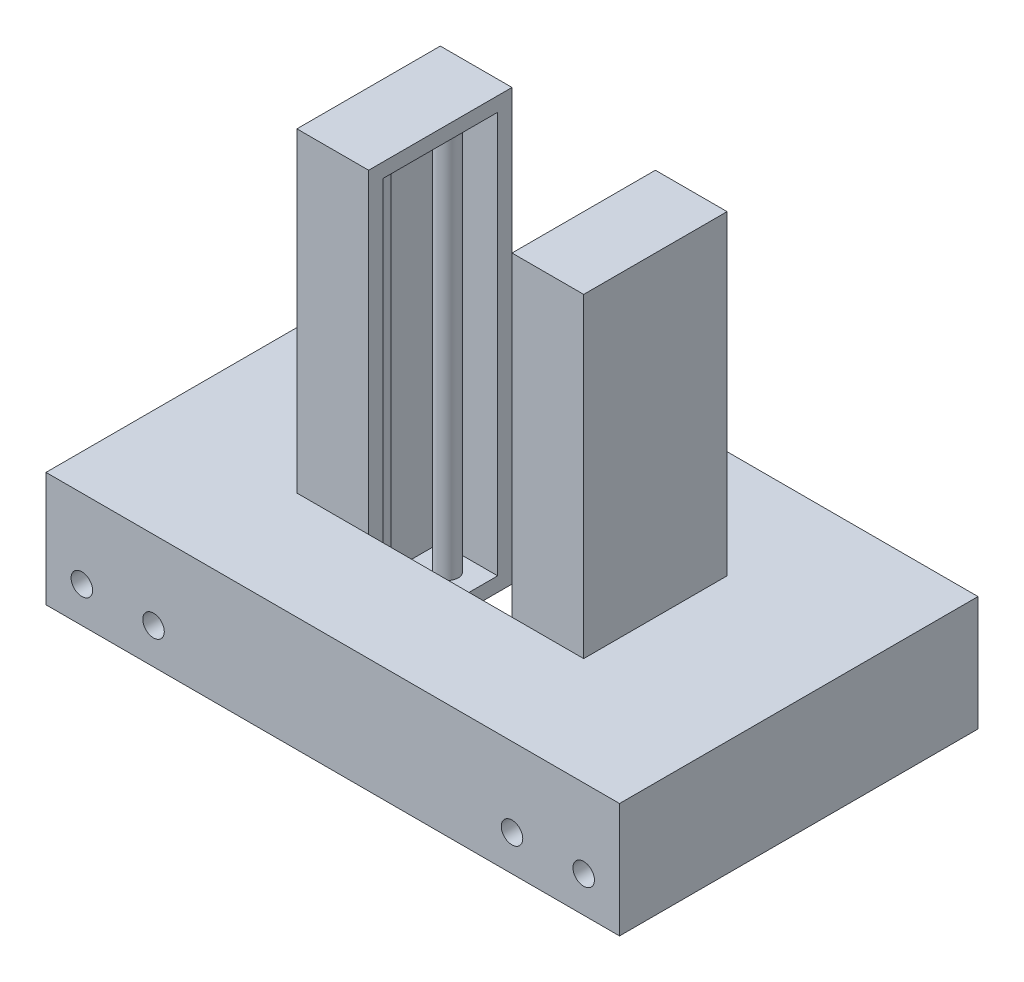
ISO-10303-21;
HEADER;
FILE_DESCRIPTION(('STEP AP214'),'2;1');
FILE_NAME('part.step','',(''),(''),'','','');
FILE_SCHEMA(('AUTOMOTIVE_DESIGN { 1 0 10303 214 1 1 1 1 }'));
ENDSEC;
DATA;
#1=APPLICATION_CONTEXT('core data for automotive mechanical design processes');
#2=APPLICATION_PROTOCOL_DEFINITION('international standard','automotive_design',2000,#1);
#3=PRODUCT_CONTEXT('',#1,'mechanical');
#4=PRODUCT('Part','Part','',(#3));
#5=PRODUCT_RELATED_PRODUCT_CATEGORY('part','',(#4));
#6=PRODUCT_DEFINITION_FORMATION('','',#4);
#7=PRODUCT_DEFINITION_CONTEXT('part definition',#1,'design');
#8=PRODUCT_DEFINITION('design','',#6,#7);
#9=PRODUCT_DEFINITION_SHAPE('','',#8);
#10=(LENGTH_UNIT() NAMED_UNIT(*) SI_UNIT(.MILLI.,.METRE.));
#11=(NAMED_UNIT(*) PLANE_ANGLE_UNIT() SI_UNIT($,.RADIAN.));
#12=(NAMED_UNIT(*) SI_UNIT($,.STERADIAN.) SOLID_ANGLE_UNIT());
#13=UNCERTAINTY_MEASURE_WITH_UNIT(LENGTH_MEASURE(1.E-05),#10,'distance_accuracy_value','');
#14=(GEOMETRIC_REPRESENTATION_CONTEXT(3) GLOBAL_UNCERTAINTY_ASSIGNED_CONTEXT((#13)) GLOBAL_UNIT_ASSIGNED_CONTEXT((#10,
#11,#12)) REPRESENTATION_CONTEXT('',''));
#15=CARTESIAN_POINT('',(0.,0.,0.));
#16=DIRECTION('',(0.,0.,1.));
#17=DIRECTION('',(1.,0.,0.));
#18=AXIS2_PLACEMENT_3D('',#15,#16,#17);
#19=CARTESIAN_POINT('',(-150.,0.,-1.38777878078145E-13));
#20=DIRECTION('',(1.,0.,0.));
#21=DIRECTION('',(0.,0.,1.));
#22=AXIS2_PLACEMENT_3D('',#19,#20,#21);
#23=PLANE('',#22);
#24=DIRECTION('',(0.,-1.,0.));
#25=VECTOR('',#24,1.);
#26=CARTESIAN_POINT('',(-150.,0.,-75.));
#27=LINE('',#26,#25);
#28=CARTESIAN_POINT('',(-150.,300.,-75.));
#29=VERTEX_POINT('',#28);
#30=CARTESIAN_POINT('',(-150.,80.,-75.));
#31=VERTEX_POINT('',#30);
#32=EDGE_CURVE('E238',#29,#31,#27,.T.);
#33=ORIENTED_EDGE('',*,*,#32,.F.);
#34=DIRECTION('',(0.,0.,1.));
#35=VECTOR('',#34,1.);
#36=CARTESIAN_POINT('',(-150.,300.,-75.));
#37=LINE('',#36,#35);
#38=CARTESIAN_POINT('',(-150.,300.,-175.));
#39=VERTEX_POINT('',#38);
#40=EDGE_CURVE('E241',#39,#29,#37,.T.);
#41=ORIENTED_EDGE('',*,*,#40,.F.);
#42=DIRECTION('',(0.,1.,0.));
#43=VECTOR('',#42,1.);
#44=CARTESIAN_POINT('',(-150.,0.,-175.));
#45=LINE('',#44,#43);
#46=CARTESIAN_POINT('',(-150.,80.,-175.));
#47=VERTEX_POINT('',#46);
#48=EDGE_CURVE('E245',#47,#39,#45,.T.);
#49=ORIENTED_EDGE('',*,*,#48,.F.);
#50=CARTESIAN_POINT('',(-150.,0.,-175.));
#51=VERTEX_POINT('',#50);
#52=EDGE_CURVE('E246',#51,#47,#45,.T.);
#53=ORIENTED_EDGE('',*,*,#52,.F.);
#54=DIRECTION('',(0.,0.,-1.));
#55=VECTOR('',#54,1.);
#56=CARTESIAN_POINT('',(-150.,0.,-75.));
#57=LINE('',#56,#55);
#58=CARTESIAN_POINT('',(-150.,0.,-75.));
#59=VERTEX_POINT('',#58);
#60=EDGE_CURVE('E249',#59,#51,#57,.T.);
#61=ORIENTED_EDGE('',*,*,#60,.F.);
#62=EDGE_CURVE('E242',#31,#59,#27,.T.);
#63=ORIENTED_EDGE('',*,*,#62,.F.);
#64=EDGE_LOOP('',(#33,#41,#49,#53,#61,#63));
#65=FACE_BOUND('',#64,.T.);
#66=DIRECTION('',(0.,-1.,0.));
#67=VECTOR('',#66,1.);
#68=CARTESIAN_POINT('',(-150.,290.,-85.));
#69=LINE('',#68,#67);
#70=CARTESIAN_POINT('',(-150.,290.,-85.));
#71=VERTEX_POINT('',#70);
#72=CARTESIAN_POINT('',(-150.,10.,-85.));
#73=VERTEX_POINT('',#72);
#74=EDGE_CURVE('E65',#71,#73,#69,.T.);
#75=ORIENTED_EDGE('',*,*,#74,.T.);
#76=DIRECTION('',(0.,0.,-1.));
#77=VECTOR('',#76,1.);
#78=CARTESIAN_POINT('',(-150.,10.,-85.));
#79=LINE('',#78,#77);
#80=CARTESIAN_POINT('',(-150.,10.,-165.));
#81=VERTEX_POINT('',#80);
#82=EDGE_CURVE('E219',#73,#81,#79,.T.);
#83=ORIENTED_EDGE('',*,*,#82,.T.);
#84=DIRECTION('',(0.,1.,0.));
#85=VECTOR('',#84,1.);
#86=CARTESIAN_POINT('',(-150.,290.,-165.));
#87=LINE('',#86,#85);
#88=CARTESIAN_POINT('',(-150.,290.,-165.));
#89=VERTEX_POINT('',#88);
#90=EDGE_CURVE('E222',#81,#89,#87,.T.);
#91=ORIENTED_EDGE('',*,*,#90,.T.);
#92=DIRECTION('',(0.,0.,1.));
#93=VECTOR('',#92,1.);
#94=CARTESIAN_POINT('',(-150.,290.,-85.));
#95=LINE('',#94,#93);
#96=EDGE_CURVE('E228',#89,#71,#95,.T.);
#97=ORIENTED_EDGE('',*,*,#96,.T.);
#98=EDGE_LOOP('',(#75,#83,#91,#97));
#99=FACE_BOUND('',#98,.T.);
#100=ADVANCED_FACE('F50',(#65,#99),#23,.F.);
#101=CARTESIAN_POINT('',(-300.,0.,-175.));
#102=DIRECTION('',(0.,0.,-1.));
#103=DIRECTION('',(-1.,0.,0.));
#104=AXIS2_PLACEMENT_3D('',#101,#102,#103);
#105=PLANE('',#104);
#106=ORIENTED_EDGE('',*,*,#52,.T.);
#107=DIRECTION('',(-1.,0.,0.));
#108=VECTOR('',#107,1.);
#109=CARTESIAN_POINT('',(-300.,80.,-175.));
#110=LINE('',#109,#108);
#111=CARTESIAN_POINT('',(-250.,80.,-175.));
#112=VERTEX_POINT('',#111);
#113=EDGE_CURVE('E339',#47,#112,#110,.T.);
#114=ORIENTED_EDGE('',*,*,#113,.T.);
#115=DIRECTION('',(0.,1.,0.));
#116=VECTOR('',#115,1.);
#117=CARTESIAN_POINT('',(-250.,0.,-175.));
#118=LINE('',#117,#116);
#119=CARTESIAN_POINT('',(-250.,0.,-175.));
#120=VERTEX_POINT('',#119);
#121=EDGE_CURVE('E305',#120,#112,#118,.T.);
#122=ORIENTED_EDGE('',*,*,#121,.F.);
#123=DIRECTION('',(-1.,0.,0.));
#124=VECTOR('',#123,1.);
#125=CARTESIAN_POINT('',(-300.,0.,-175.));
#126=LINE('',#125,#124);
#127=EDGE_CURVE('E325',#51,#120,#126,.T.);
#128=ORIENTED_EDGE('',*,*,#127,.F.);
#129=EDGE_LOOP('',(#106,#114,#122,#128));
#130=FACE_BOUND('',#129,.T.);
#131=ADVANCED_FACE('F438',(#130),#105,.F.);
#132=CARTESIAN_POINT('',(-300.,0.,-75.));
#133=DIRECTION('',(0.,0.,1.));
#134=DIRECTION('',(1.,0.,0.));
#135=AXIS2_PLACEMENT_3D('',#132,#133,#134);
#136=PLANE('',#135);
#137=ORIENTED_EDGE('',*,*,#62,.T.);
#138=DIRECTION('',(1.,0.,0.));
#139=VECTOR('',#138,1.);
#140=CARTESIAN_POINT('',(-300.,0.,-75.));
#141=LINE('',#140,#139);
#142=CARTESIAN_POINT('',(-250.,0.,-75.));
#143=VERTEX_POINT('',#142);
#144=EDGE_CURVE('E322',#143,#59,#141,.T.);
#145=ORIENTED_EDGE('',*,*,#144,.F.);
#146=DIRECTION('',(0.,-1.,0.));
#147=VECTOR('',#146,1.);
#148=CARTESIAN_POINT('',(-250.,0.,-75.));
#149=LINE('',#148,#147);
#150=CARTESIAN_POINT('',(-250.,80.,-75.));
#151=VERTEX_POINT('',#150);
#152=EDGE_CURVE('E393',#151,#143,#149,.T.);
#153=ORIENTED_EDGE('',*,*,#152,.F.);
#154=DIRECTION('',(1.,0.,0.));
#155=VECTOR('',#154,1.);
#156=CARTESIAN_POINT('',(-300.,80.,-75.));
#157=LINE('',#156,#155);
#158=EDGE_CURVE('E331',#151,#31,#157,.T.);
#159=ORIENTED_EDGE('',*,*,#158,.T.);
#160=EDGE_LOOP('',(#137,#145,#153,#159));
#161=FACE_BOUND('',#160,.T.);
#162=ADVANCED_FACE('F445',(#161),#136,.F.);
#163=CARTESIAN_POINT('',(0.,80.,0.));
#164=DIRECTION('',(-1.,0.,0.));
#165=DIRECTION('',(0.,0.,1.));
#166=AXIS2_PLACEMENT_3D('',#163,#164,#165);
#167=PLANE('',#166);
#168=DIRECTION('',(0.,0.,-1.));
#169=VECTOR('',#168,1.);
#170=CARTESIAN_POINT('',(0.,0.,0.));
#171=LINE('',#170,#169);
#172=CARTESIAN_POINT('',(0.,0.,0.));
#173=VERTEX_POINT('',#172);
#174=CARTESIAN_POINT('',(0.,0.,-250.));
#175=VERTEX_POINT('',#174);
#176=EDGE_CURVE('E343',#173,#175,#171,.T.);
#177=ORIENTED_EDGE('',*,*,#176,.T.);
#178=DIRECTION('',(0.,-1.,0.));
#179=VECTOR('',#178,1.);
#180=CARTESIAN_POINT('',(0.,80.,-250.));
#181=LINE('',#180,#179);
#182=CARTESIAN_POINT('',(0.,80.,-250.));
#183=VERTEX_POINT('',#182);
#184=EDGE_CURVE('E390',#183,#175,#181,.T.);
#185=ORIENTED_EDGE('',*,*,#184,.F.);
#186=DIRECTION('',(0.,0.,-1.));
#187=VECTOR('',#186,1.);
#188=CARTESIAN_POINT('',(0.,80.,0.));
#189=LINE('',#188,#187);
#190=CARTESIAN_POINT('',(0.,80.,0.));
#191=VERTEX_POINT('',#190);
#192=EDGE_CURVE('E364',#191,#183,#189,.T.);
#193=ORIENTED_EDGE('',*,*,#192,.F.);
#194=DIRECTION('',(0.,-1.,0.));
#195=VECTOR('',#194,1.);
#196=CARTESIAN_POINT('',(0.,80.,0.));
#197=LINE('',#196,#195);
#198=EDGE_CURVE('E374',#191,#173,#197,.T.);
#199=ORIENTED_EDGE('',*,*,#198,.T.);
#200=EDGE_LOOP('',(#177,#185,#193,#199));
#201=FACE_BOUND('',#200,.T.);
#202=ADVANCED_FACE('F52',(#201),#167,.F.);
#203=CARTESIAN_POINT('',(0.,80.,-250.));
#204=DIRECTION('',(0.,0.,1.));
#205=DIRECTION('',(1.,0.,0.));
#206=AXIS2_PLACEMENT_3D('',#203,#204,#205);
#207=PLANE('',#206);
#208=CARTESIAN_POINT('',(-375.,25.,-250.));
#209=DIRECTION('',(0.,0.,1.));
#210=DIRECTION('',(1.,0.,0.));
#211=AXIS2_PLACEMENT_3D('',#208,#209,#210);
#212=CIRCLE('',#211,7.50000000000001);
#213=CARTESIAN_POINT('',(-367.5,25.,-250.));
#214=VERTEX_POINT('',#213);
#215=EDGE_CURVE('E340',#214,#214,#212,.T.);
#216=ORIENTED_EDGE('',*,*,#215,.T.);
#217=EDGE_LOOP('',(#216));
#218=FACE_BOUND('',#217,.T.);
#219=CARTESIAN_POINT('',(-325.,25.,-250.));
#220=DIRECTION('',(0.,0.,1.));
#221=DIRECTION('',(1.,0.,0.));
#222=AXIS2_PLACEMENT_3D('',#219,#220,#221);
#223=CIRCLE('',#222,7.50000000000001);
#224=CARTESIAN_POINT('',(-317.5,25.,-250.));
#225=VERTEX_POINT('',#224);
#226=EDGE_CURVE('E350',#225,#225,#223,.T.);
#227=ORIENTED_EDGE('',*,*,#226,.T.);
#228=EDGE_LOOP('',(#227));
#229=FACE_BOUND('',#228,.T.);
#230=CARTESIAN_POINT('',(-75.,25.,-250.));
#231=DIRECTION('',(0.,0.,1.));
#232=DIRECTION('',(1.,0.,0.));
#233=AXIS2_PLACEMENT_3D('',#230,#231,#232);
#234=CIRCLE('',#233,7.50000000000001);
#235=CARTESIAN_POINT('',(-67.5,25.,-250.));
#236=VERTEX_POINT('',#235);
#237=EDGE_CURVE('E356',#236,#236,#234,.T.);
#238=ORIENTED_EDGE('',*,*,#237,.T.);
#239=EDGE_LOOP('',(#238));
#240=FACE_BOUND('',#239,.T.);
#241=CARTESIAN_POINT('',(-25.,25.,-250.));
#242=DIRECTION('',(0.,0.,1.));
#243=DIRECTION('',(1.,0.,0.));
#244=AXIS2_PLACEMENT_3D('',#241,#242,#243);
#245=CIRCLE('',#244,7.5);
#246=CARTESIAN_POINT('',(-17.5,25.,-250.));
#247=VERTEX_POINT('',#246);
#248=EDGE_CURVE('E328',#247,#247,#245,.T.);
#249=ORIENTED_EDGE('',*,*,#248,.T.);
#250=EDGE_LOOP('',(#249));
#251=FACE_BOUND('',#250,.T.);
#252=DIRECTION('',(-1.,0.,0.));
#253=VECTOR('',#252,1.);
#254=CARTESIAN_POINT('',(0.,0.,-250.));
#255=LINE('',#254,#253);
#256=CARTESIAN_POINT('',(-400.,0.,-250.));
#257=VERTEX_POINT('',#256);
#258=EDGE_CURVE('E377',#175,#257,#255,.T.);
#259=ORIENTED_EDGE('',*,*,#258,.T.);
#260=DIRECTION('',(0.,-1.,0.));
#261=VECTOR('',#260,1.);
#262=CARTESIAN_POINT('',(-400.,80.,-250.));
#263=LINE('',#262,#261);
#264=CARTESIAN_POINT('',(-400.,80.,-250.));
#265=VERTEX_POINT('',#264);
#266=EDGE_CURVE('E387',#265,#257,#263,.T.);
#267=ORIENTED_EDGE('',*,*,#266,.F.);
#268=DIRECTION('',(-1.,0.,0.));
#269=VECTOR('',#268,1.);
#270=CARTESIAN_POINT('',(0.,80.,-250.));
#271=LINE('',#270,#269);
#272=EDGE_CURVE('E367',#183,#265,#271,.T.);
#273=ORIENTED_EDGE('',*,*,#272,.F.);
#274=ORIENTED_EDGE('',*,*,#184,.T.);
#275=EDGE_LOOP('',(#259,#267,#273,#274));
#276=FACE_BOUND('',#275,.T.);
#277=ADVANCED_FACE('F538',(#218,#229,#240,#251,#276),#207,.F.);
#278=CARTESIAN_POINT('',(-400.,80.,0.));
#279=DIRECTION('',(1.,0.,0.));
#280=DIRECTION('',(0.,0.,-1.));
#281=AXIS2_PLACEMENT_3D('',#278,#279,#280);
#282=PLANE('',#281);
#283=DIRECTION('',(0.,0.,1.));
#284=VECTOR('',#283,1.);
#285=CARTESIAN_POINT('',(-400.,0.,0.));
#286=LINE('',#285,#284);
#287=CARTESIAN_POINT('',(-400.,0.,0.));
#288=VERTEX_POINT('',#287);
#289=EDGE_CURVE('E379',#257,#288,#286,.T.);
#290=ORIENTED_EDGE('',*,*,#289,.T.);
#291=DIRECTION('',(0.,-1.,0.));
#292=VECTOR('',#291,1.);
#293=CARTESIAN_POINT('',(-400.,80.,0.));
#294=LINE('',#293,#292);
#295=CARTESIAN_POINT('',(-400.,80.,0.));
#296=VERTEX_POINT('',#295);
#297=EDGE_CURVE('E384',#296,#288,#294,.T.);
#298=ORIENTED_EDGE('',*,*,#297,.F.);
#299=DIRECTION('',(0.,0.,1.));
#300=VECTOR('',#299,1.);
#301=CARTESIAN_POINT('',(-400.,80.,0.));
#302=LINE('',#301,#300);
#303=EDGE_CURVE('E370',#265,#296,#302,.T.);
#304=ORIENTED_EDGE('',*,*,#303,.F.);
#305=ORIENTED_EDGE('',*,*,#266,.T.);
#306=EDGE_LOOP('',(#290,#298,#304,#305));
#307=FACE_BOUND('',#306,.T.);
#308=ADVANCED_FACE('F535',(#307),#282,.F.);
#309=CARTESIAN_POINT('',(0.,80.,0.));
#310=DIRECTION('',(0.,0.,-1.));
#311=DIRECTION('',(-1.,0.,0.));
#312=AXIS2_PLACEMENT_3D('',#309,#310,#311);
#313=PLANE('',#312);
#314=CARTESIAN_POINT('',(-375.,25.,0.));
#315=DIRECTION('',(0.,0.,1.));
#316=DIRECTION('',(1.,0.,0.));
#317=AXIS2_PLACEMENT_3D('',#314,#315,#316);
#318=CIRCLE('',#317,7.50000000000001);
#319=CARTESIAN_POINT('',(-367.5,25.,0.));
#320=VERTEX_POINT('',#319);
#321=EDGE_CURVE('E344',#320,#320,#318,.T.);
#322=ORIENTED_EDGE('',*,*,#321,.F.);
#323=EDGE_LOOP('',(#322));
#324=FACE_BOUND('',#323,.T.);
#325=CARTESIAN_POINT('',(-325.,25.,0.));
#326=DIRECTION('',(0.,0.,1.));
#327=DIRECTION('',(1.,0.,0.));
#328=AXIS2_PLACEMENT_3D('',#325,#326,#327);
#329=CIRCLE('',#328,7.50000000000001);
#330=CARTESIAN_POINT('',(-317.5,25.,0.));
#331=VERTEX_POINT('',#330);
#332=EDGE_CURVE('E347',#331,#331,#329,.T.);
#333=ORIENTED_EDGE('',*,*,#332,.F.);
#334=EDGE_LOOP('',(#333));
#335=FACE_BOUND('',#334,.T.);
#336=CARTESIAN_POINT('',(-75.,25.,0.));
#337=DIRECTION('',(0.,0.,1.));
#338=DIRECTION('',(1.,0.,0.));
#339=AXIS2_PLACEMENT_3D('',#336,#337,#338);
#340=CIRCLE('',#339,7.50000000000001);
#341=CARTESIAN_POINT('',(-67.5,25.,0.));
#342=VERTEX_POINT('',#341);
#343=EDGE_CURVE('E353',#342,#342,#340,.T.);
#344=ORIENTED_EDGE('',*,*,#343,.F.);
#345=EDGE_LOOP('',(#344));
#346=FACE_BOUND('',#345,.T.);
#347=CARTESIAN_POINT('',(-25.,25.,0.));
#348=DIRECTION('',(0.,0.,1.));
#349=DIRECTION('',(1.,0.,0.));
#350=AXIS2_PLACEMENT_3D('',#347,#348,#349);
#351=CIRCLE('',#350,7.5);
#352=CARTESIAN_POINT('',(-17.5,25.,0.));
#353=VERTEX_POINT('',#352);
#354=EDGE_CURVE('E359',#353,#353,#351,.T.);
#355=ORIENTED_EDGE('',*,*,#354,.F.);
#356=EDGE_LOOP('',(#355));
#357=FACE_BOUND('',#356,.T.);
#358=DIRECTION('',(1.,0.,0.));
#359=VECTOR('',#358,1.);
#360=CARTESIAN_POINT('',(0.,0.,0.));
#361=LINE('',#360,#359);
#362=EDGE_CURVE('E368',#288,#173,#361,.T.);
#363=ORIENTED_EDGE('',*,*,#362,.T.);
#364=ORIENTED_EDGE('',*,*,#198,.F.);
#365=DIRECTION('',(1.,0.,0.));
#366=VECTOR('',#365,1.);
#367=CARTESIAN_POINT('',(0.,80.,0.));
#368=LINE('',#367,#366);
#369=EDGE_CURVE('E372',#296,#191,#368,.T.);
#370=ORIENTED_EDGE('',*,*,#369,.F.);
#371=ORIENTED_EDGE('',*,*,#297,.T.);
#372=EDGE_LOOP('',(#363,#364,#370,#371));
#373=FACE_BOUND('',#372,.T.);
#374=ADVANCED_FACE('F528',(#324,#335,#346,#357,#373),#313,.F.);
#375=CARTESIAN_POINT('',(0.,80.,0.));
#376=DIRECTION('',(0.,1.,0.));
#377=DIRECTION('',(0.,0.,1.));
#378=AXIS2_PLACEMENT_3D('',#375,#376,#377);
#379=PLANE('',#378);
#380=DIRECTION('',(0.,0.,1.));
#381=VECTOR('',#380,1.);
#382=CARTESIAN_POINT('',(-300.,80.,-175.));
#383=LINE('',#382,#381);
#384=CARTESIAN_POINT('',(-300.,80.,-175.));
#385=VERTEX_POINT('',#384);
#386=CARTESIAN_POINT('',(-300.,80.,-75.));
#387=VERTEX_POINT('',#386);
#388=EDGE_CURVE('E321',#385,#387,#383,.T.);
#389=ORIENTED_EDGE('',*,*,#388,.F.);
#390=EDGE_CURVE('E337',#112,#385,#110,.T.);
#391=ORIENTED_EDGE('',*,*,#390,.F.);
#392=ORIENTED_EDGE('',*,*,#113,.F.);
#393=CARTESIAN_POINT('',(-100.,80.,-175.));
#394=VERTEX_POINT('',#393);
#395=EDGE_CURVE('E326',#394,#47,#110,.T.);
#396=ORIENTED_EDGE('',*,*,#395,.F.);
#397=DIRECTION('',(0.,0.,-1.));
#398=VECTOR('',#397,1.);
#399=CARTESIAN_POINT('',(-100.,80.,-175.));
#400=LINE('',#399,#398);
#401=CARTESIAN_POINT('',(-99.9999999999999,80.,-75.));
#402=VERTEX_POINT('',#401);
#403=EDGE_CURVE('E335',#402,#394,#400,.T.);
#404=ORIENTED_EDGE('',*,*,#403,.F.);
#405=DIRECTION('',(1.,0.,0.));
#406=VECTOR('',#405,1.);
#407=CARTESIAN_POINT('',(0.,80.,-75.));
#408=LINE('',#407,#406);
#409=EDGE_CURVE('E264',#31,#402,#408,.T.);
#410=ORIENTED_EDGE('',*,*,#409,.F.);
#411=ORIENTED_EDGE('',*,*,#158,.F.);
#412=EDGE_CURVE('E332',#387,#151,#157,.T.);
#413=ORIENTED_EDGE('',*,*,#412,.F.);
#414=EDGE_LOOP('',(#389,#391,#392,#396,#404,#410,#411,#413));
#415=FACE_BOUND('',#414,.T.);
#416=ORIENTED_EDGE('',*,*,#192,.T.);
#417=ORIENTED_EDGE('',*,*,#272,.T.);
#418=ORIENTED_EDGE('',*,*,#303,.T.);
#419=ORIENTED_EDGE('',*,*,#369,.T.);
#420=EDGE_LOOP('',(#416,#417,#418,#419));
#421=FACE_BOUND('',#420,.T.);
#422=ADVANCED_FACE('F525',(#415,#421),#379,.T.);
#423=CARTESIAN_POINT('',(0.,0.,0.));
#424=DIRECTION('',(0.,1.,0.));
#425=DIRECTION('',(0.,0.,1.));
#426=AXIS2_PLACEMENT_3D('',#423,#424,#425);
#427=PLANE('',#426);
#428=ORIENTED_EDGE('',*,*,#60,.T.);
#429=ORIENTED_EDGE('',*,*,#127,.T.);
#430=DIRECTION('',(0.,0.,-1.));
#431=VECTOR('',#430,1.);
#432=CARTESIAN_POINT('',(-250.,0.,-75.));
#433=LINE('',#432,#431);
#434=EDGE_CURVE('E300',#143,#120,#433,.T.);
#435=ORIENTED_EDGE('',*,*,#434,.F.);
#436=ORIENTED_EDGE('',*,*,#144,.T.);
#437=EDGE_LOOP('',(#428,#429,#435,#436));
#438=FACE_BOUND('',#437,.T.);
#439=ORIENTED_EDGE('',*,*,#176,.F.);
#440=ORIENTED_EDGE('',*,*,#362,.F.);
#441=ORIENTED_EDGE('',*,*,#289,.F.);
#442=ORIENTED_EDGE('',*,*,#258,.F.);
#443=EDGE_LOOP('',(#439,#440,#441,#442));
#444=FACE_BOUND('',#443,.T.);
#445=ADVANCED_FACE('F523',(#438,#444),#427,.F.);
#446=CARTESIAN_POINT('',(-25.,25.,-250.));
#447=DIRECTION('',(0.,0.,1.));
#448=DIRECTION('',(1.,0.,0.));
#449=AXIS2_PLACEMENT_3D('',#446,#447,#448);
#450=CYLINDRICAL_SURFACE('',#449,7.5);
#451=ORIENTED_EDGE('',*,*,#248,.F.);
#452=EDGE_LOOP('',(#451));
#453=FACE_BOUND('',#452,.T.);
#454=ORIENTED_EDGE('',*,*,#354,.T.);
#455=EDGE_LOOP('',(#454));
#456=FACE_BOUND('',#455,.T.);
#457=ADVANCED_FACE('F519',(#453,#456),#450,.F.);
#458=CARTESIAN_POINT('',(-75.,25.,-250.));
#459=DIRECTION('',(0.,0.,1.));
#460=DIRECTION('',(1.,0.,0.));
#461=AXIS2_PLACEMENT_3D('',#458,#459,#460);
#462=CYLINDRICAL_SURFACE('',#461,7.50000000000001);
#463=ORIENTED_EDGE('',*,*,#237,.F.);
#464=EDGE_LOOP('',(#463));
#465=FACE_BOUND('',#464,.T.);
#466=ORIENTED_EDGE('',*,*,#343,.T.);
#467=EDGE_LOOP('',(#466));
#468=FACE_BOUND('',#467,.T.);
#469=ADVANCED_FACE('F515',(#465,#468),#462,.F.);
#470=CARTESIAN_POINT('',(-325.,25.,-250.));
#471=DIRECTION('',(0.,0.,1.));
#472=DIRECTION('',(1.,0.,0.));
#473=AXIS2_PLACEMENT_3D('',#470,#471,#472);
#474=CYLINDRICAL_SURFACE('',#473,7.50000000000001);
#475=ORIENTED_EDGE('',*,*,#226,.F.);
#476=EDGE_LOOP('',(#475));
#477=FACE_BOUND('',#476,.T.);
#478=ORIENTED_EDGE('',*,*,#332,.T.);
#479=EDGE_LOOP('',(#478));
#480=FACE_BOUND('',#479,.T.);
#481=ADVANCED_FACE('F511',(#477,#480),#474,.F.);
#482=CARTESIAN_POINT('',(-375.,25.,-250.));
#483=DIRECTION('',(0.,0.,1.));
#484=DIRECTION('',(1.,0.,0.));
#485=AXIS2_PLACEMENT_3D('',#482,#483,#484);
#486=CYLINDRICAL_SURFACE('',#485,7.50000000000001);
#487=ORIENTED_EDGE('',*,*,#215,.F.);
#488=EDGE_LOOP('',(#487));
#489=FACE_BOUND('',#488,.T.);
#490=ORIENTED_EDGE('',*,*,#321,.T.);
#491=EDGE_LOOP('',(#490));
#492=FACE_BOUND('',#491,.T.);
#493=ADVANCED_FACE('F503',(#489,#492),#486,.F.);
#494=CARTESIAN_POINT('',(-250.,0.,-75.));
#495=DIRECTION('',(0.,0.,-1.));
#496=DIRECTION('',(-1.,0.,0.));
#497=AXIS2_PLACEMENT_3D('',#494,#495,#496);
#498=PLANE('',#497);
#499=ORIENTED_EDGE('',*,*,#412,.T.);
#500=DIRECTION('',(0.,-1.,0.));
#501=VECTOR('',#500,1.);
#502=CARTESIAN_POINT('',(-250.,0.,-75.));
#503=LINE('',#502,#501);
#504=CARTESIAN_POINT('',(-250.,300.,-75.));
#505=VERTEX_POINT('',#504);
#506=EDGE_CURVE('E297',#505,#151,#503,.T.);
#507=ORIENTED_EDGE('',*,*,#506,.F.);
#508=DIRECTION('',(-1.,0.,0.));
#509=VECTOR('',#508,1.);
#510=CARTESIAN_POINT('',(-250.,300.,-75.));
#511=LINE('',#510,#509);
#512=CARTESIAN_POINT('',(-300.,300.,-75.));
#513=VERTEX_POINT('',#512);
#514=EDGE_CURVE('E310',#505,#513,#511,.T.);
#515=ORIENTED_EDGE('',*,*,#514,.T.);
#516=DIRECTION('',(0.,-1.,0.));
#517=VECTOR('',#516,1.);
#518=CARTESIAN_POINT('',(-300.,0.,-75.));
#519=LINE('',#518,#517);
#520=EDGE_CURVE('E291',#513,#387,#519,.T.);
#521=ORIENTED_EDGE('',*,*,#520,.T.);
#522=EDGE_LOOP('',(#499,#507,#515,#521));
#523=FACE_BOUND('',#522,.T.);
#524=ADVANCED_FACE('F500',(#523),#498,.F.);
#525=CARTESIAN_POINT('',(-250.,0.,-175.));
#526=DIRECTION('',(0.,0.,1.));
#527=DIRECTION('',(1.,0.,0.));
#528=AXIS2_PLACEMENT_3D('',#525,#526,#527);
#529=PLANE('',#528);
#530=ORIENTED_EDGE('',*,*,#390,.T.);
#531=DIRECTION('',(0.,1.,0.));
#532=VECTOR('',#531,1.);
#533=CARTESIAN_POINT('',(-300.,0.,-175.));
#534=LINE('',#533,#532);
#535=CARTESIAN_POINT('',(-300.,300.,-175.));
#536=VERTEX_POINT('',#535);
#537=EDGE_CURVE('E313',#385,#536,#534,.T.);
#538=ORIENTED_EDGE('',*,*,#537,.T.);
#539=DIRECTION('',(-1.,0.,0.));
#540=VECTOR('',#539,1.);
#541=CARTESIAN_POINT('',(-250.,300.,-175.));
#542=LINE('',#541,#540);
#543=CARTESIAN_POINT('',(-250.,300.,-175.));
#544=VERTEX_POINT('',#543);
#545=EDGE_CURVE('E318',#544,#536,#542,.T.);
#546=ORIENTED_EDGE('',*,*,#545,.F.);
#547=EDGE_CURVE('E304',#112,#544,#118,.T.);
#548=ORIENTED_EDGE('',*,*,#547,.F.);
#549=EDGE_LOOP('',(#530,#538,#546,#548));
#550=FACE_BOUND('',#549,.T.);
#551=ADVANCED_FACE('F496',(#550),#529,.F.);
#552=CARTESIAN_POINT('',(-250.,300.,-75.));
#553=DIRECTION('',(0.,-1.,0.));
#554=DIRECTION('',(0.,0.,-1.));
#555=AXIS2_PLACEMENT_3D('',#552,#553,#554);
#556=PLANE('',#555);
#557=DIRECTION('',(0.,0.,1.));
#558=VECTOR('',#557,1.);
#559=CARTESIAN_POINT('',(-300.,300.,-75.));
#560=LINE('',#559,#558);
#561=EDGE_CURVE('E301',#536,#513,#560,.T.);
#562=ORIENTED_EDGE('',*,*,#561,.T.);
#563=ORIENTED_EDGE('',*,*,#514,.F.);
#564=DIRECTION('',(0.,0.,1.));
#565=VECTOR('',#564,1.);
#566=CARTESIAN_POINT('',(-250.,300.,-75.));
#567=LINE('',#566,#565);
#568=EDGE_CURVE('E308',#544,#505,#567,.T.);
#569=ORIENTED_EDGE('',*,*,#568,.F.);
#570=ORIENTED_EDGE('',*,*,#545,.T.);
#571=EDGE_LOOP('',(#562,#563,#569,#570));
#572=FACE_BOUND('',#571,.T.);
#573=ADVANCED_FACE('F489',(#572),#556,.F.);
#574=CARTESIAN_POINT('',(-250.,0.,-1.38777878078145E-13));
#575=DIRECTION('',(-1.,0.,0.));
#576=DIRECTION('',(0.,0.,1.));
#577=AXIS2_PLACEMENT_3D('',#574,#575,#576);
#578=PLANE('',#577);
#579=DIRECTION('',(0.,0.,-1.));
#580=VECTOR('',#579,1.);
#581=CARTESIAN_POINT('',(-250.,10.,-85.));
#582=LINE('',#581,#580);
#583=CARTESIAN_POINT('',(-250.,10.,-85.));
#584=VERTEX_POINT('',#583);
#585=CARTESIAN_POINT('',(-250.,10.,-165.));
#586=VERTEX_POINT('',#585);
#587=EDGE_CURVE('E281',#584,#586,#582,.T.);
#588=ORIENTED_EDGE('',*,*,#587,.F.);
#589=DIRECTION('',(0.,-1.,0.));
#590=VECTOR('',#589,1.);
#591=CARTESIAN_POINT('',(-250.,290.,-85.));
#592=LINE('',#591,#590);
#593=CARTESIAN_POINT('',(-250.,290.,-85.));
#594=VERTEX_POINT('',#593);
#595=EDGE_CURVE('E73',#594,#584,#592,.T.);
#596=ORIENTED_EDGE('',*,*,#595,.F.);
#597=DIRECTION('',(0.,0.,1.));
#598=VECTOR('',#597,1.);
#599=CARTESIAN_POINT('',(-250.,290.,-85.));
#600=LINE('',#599,#598);
#601=CARTESIAN_POINT('',(-250.,290.,-165.));
#602=VERTEX_POINT('',#601);
#603=EDGE_CURVE('E270',#602,#594,#600,.T.);
#604=ORIENTED_EDGE('',*,*,#603,.F.);
#605=DIRECTION('',(0.,1.,0.));
#606=VECTOR('',#605,1.);
#607=CARTESIAN_POINT('',(-250.,290.,-165.));
#608=LINE('',#607,#606);
#609=EDGE_CURVE('E284',#586,#602,#608,.T.);
#610=ORIENTED_EDGE('',*,*,#609,.F.);
#611=EDGE_LOOP('',(#588,#596,#604,#610));
#612=FACE_BOUND('',#611,.T.);
#613=ORIENTED_EDGE('',*,*,#506,.T.);
#614=ORIENTED_EDGE('',*,*,#152,.T.);
#615=ORIENTED_EDGE('',*,*,#434,.T.);
#616=ORIENTED_EDGE('',*,*,#121,.T.);
#617=ORIENTED_EDGE('',*,*,#547,.T.);
#618=ORIENTED_EDGE('',*,*,#568,.T.);
#619=EDGE_LOOP('',(#613,#614,#615,#616,#617,#618));
#620=FACE_BOUND('',#619,.T.);
#621=ADVANCED_FACE('F486',(#612,#620),#578,.F.);
#622=CARTESIAN_POINT('',(-300.,0.,-1.66533453693774E-13));
#623=DIRECTION('',(-1.,0.,0.));
#624=DIRECTION('',(0.,0.,1.));
#625=AXIS2_PLACEMENT_3D('',#622,#623,#624);
#626=PLANE('',#625);
#627=ORIENTED_EDGE('',*,*,#537,.F.);
#628=ORIENTED_EDGE('',*,*,#388,.T.);
#629=ORIENTED_EDGE('',*,*,#520,.F.);
#630=ORIENTED_EDGE('',*,*,#561,.F.);
#631=EDGE_LOOP('',(#627,#628,#629,#630));
#632=FACE_BOUND('',#631,.T.);
#633=ADVANCED_FACE('F485',(#632),#626,.T.);
#634=CARTESIAN_POINT('',(-290.,290.,-85.));
#635=DIRECTION('',(0.,0.,1.));
#636=DIRECTION('',(1.,0.,0.));
#637=AXIS2_PLACEMENT_3D('',#634,#635,#636);
#638=PLANE('',#637);
#639=ORIENTED_EDGE('',*,*,#595,.T.);
#640=DIRECTION('',(1.,0.,0.));
#641=VECTOR('',#640,1.);
#642=CARTESIAN_POINT('',(-290.,10.,-85.));
#643=LINE('',#642,#641);
#644=CARTESIAN_POINT('',(-290.,10.,-85.));
#645=VERTEX_POINT('',#644);
#646=EDGE_CURVE('E279',#645,#584,#643,.T.);
#647=ORIENTED_EDGE('',*,*,#646,.F.);
#648=DIRECTION('',(0.,-1.,0.));
#649=VECTOR('',#648,1.);
#650=CARTESIAN_POINT('',(-290.,290.,-85.));
#651=LINE('',#650,#649);
#652=CARTESIAN_POINT('',(-290.,290.,-85.));
#653=VERTEX_POINT('',#652);
#654=EDGE_CURVE('E266',#653,#645,#651,.T.);
#655=ORIENTED_EDGE('',*,*,#654,.F.);
#656=DIRECTION('',(1.,0.,0.));
#657=VECTOR('',#656,1.);
#658=CARTESIAN_POINT('',(-290.,290.,-85.));
#659=LINE('',#658,#657);
#660=EDGE_CURVE('E289',#653,#594,#659,.T.);
#661=ORIENTED_EDGE('',*,*,#660,.T.);
#662=EDGE_LOOP('',(#639,#647,#655,#661));
#663=FACE_BOUND('',#662,.T.);
#664=ADVANCED_FACE('F475',(#663),#638,.F.);
#665=CARTESIAN_POINT('',(-290.,290.,-85.));
#666=DIRECTION('',(0.,1.,0.));
#667=DIRECTION('',(0.,0.,1.));
#668=AXIS2_PLACEMENT_3D('',#665,#666,#667);
#669=PLANE('',#668);
#670=CARTESIAN_POINT('',(-270.,290.,-150.));
#671=DIRECTION('',(0.,1.,0.));
#672=DIRECTION('',(0.,0.,1.));
#673=AXIS2_PLACEMENT_3D('',#670,#671,#672);
#674=CIRCLE('',#673,7.50000000000001);
#675=CARTESIAN_POINT('',(-270.,290.,-142.5));
#676=VERTEX_POINT('',#675);
#677=EDGE_CURVE('E405',#676,#676,#674,.F.);
#678=ORIENTED_EDGE('',*,*,#677,.F.);
#679=EDGE_LOOP('',(#678));
#680=FACE_BOUND('',#679,.T.);
#681=CARTESIAN_POINT('',(-270.,290.,-99.9999999999999));
#682=DIRECTION('',(0.,1.,0.));
#683=DIRECTION('',(0.,0.,1.));
#684=AXIS2_PLACEMENT_3D('',#681,#682,#683);
#685=CIRCLE('',#684,7.50000000000001);
#686=CARTESIAN_POINT('',(-270.,290.,-92.4999999999999));
#687=VERTEX_POINT('',#686);
#688=EDGE_CURVE('E402',#687,#687,#685,.F.);
#689=ORIENTED_EDGE('',*,*,#688,.F.);
#690=EDGE_LOOP('',(#689));
#691=FACE_BOUND('',#690,.T.);
#692=ORIENTED_EDGE('',*,*,#603,.T.);
#693=ORIENTED_EDGE('',*,*,#660,.F.);
#694=DIRECTION('',(0.,0.,1.));
#695=VECTOR('',#694,1.);
#696=CARTESIAN_POINT('',(-290.,290.,-85.));
#697=LINE('',#696,#695);
#698=CARTESIAN_POINT('',(-290.,290.,-165.));
#699=VERTEX_POINT('',#698);
#700=EDGE_CURVE('E276',#699,#653,#697,.T.);
#701=ORIENTED_EDGE('',*,*,#700,.F.);
#702=DIRECTION('',(1.,0.,0.));
#703=VECTOR('',#702,1.);
#704=CARTESIAN_POINT('',(-290.,290.,-165.));
#705=LINE('',#704,#703);
#706=EDGE_CURVE('E292',#699,#602,#705,.T.);
#707=ORIENTED_EDGE('',*,*,#706,.T.);
#708=EDGE_LOOP('',(#692,#693,#701,#707));
#709=FACE_BOUND('',#708,.T.);
#710=ADVANCED_FACE('F471',(#680,#691,#709),#669,.F.);
#711=CARTESIAN_POINT('',(-290.,290.,-165.));
#712=DIRECTION('',(0.,0.,-1.));
#713=DIRECTION('',(-1.,0.,0.));
#714=AXIS2_PLACEMENT_3D('',#711,#712,#713);
#715=PLANE('',#714);
#716=ORIENTED_EDGE('',*,*,#609,.T.);
#717=ORIENTED_EDGE('',*,*,#706,.F.);
#718=DIRECTION('',(0.,1.,0.));
#719=VECTOR('',#718,1.);
#720=CARTESIAN_POINT('',(-290.,290.,-165.));
#721=LINE('',#720,#719);
#722=CARTESIAN_POINT('',(-290.,10.,-165.));
#723=VERTEX_POINT('',#722);
#724=EDGE_CURVE('E273',#723,#699,#721,.T.);
#725=ORIENTED_EDGE('',*,*,#724,.F.);
#726=DIRECTION('',(1.,0.,0.));
#727=VECTOR('',#726,1.);
#728=CARTESIAN_POINT('',(-290.,10.,-165.));
#729=LINE('',#728,#727);
#730=EDGE_CURVE('E294',#723,#586,#729,.T.);
#731=ORIENTED_EDGE('',*,*,#730,.T.);
#732=EDGE_LOOP('',(#716,#717,#725,#731));
#733=FACE_BOUND('',#732,.T.);
#734=ADVANCED_FACE('F474',(#733),#715,.F.);
#735=CARTESIAN_POINT('',(-290.,10.,-85.));
#736=DIRECTION('',(0.,-1.,0.));
#737=DIRECTION('',(0.,0.,-1.));
#738=AXIS2_PLACEMENT_3D('',#735,#736,#737);
#739=PLANE('',#738);
#740=CARTESIAN_POINT('',(-270.,10.,-150.));
#741=DIRECTION('',(0.,-1.,0.));
#742=DIRECTION('',(0.,0.,-1.));
#743=AXIS2_PLACEMENT_3D('',#740,#741,#742);
#744=CIRCLE('',#743,7.50000000000001);
#745=CARTESIAN_POINT('',(-270.,10.,-157.5));
#746=VERTEX_POINT('',#745);
#747=EDGE_CURVE('E399',#746,#746,#744,.F.);
#748=ORIENTED_EDGE('',*,*,#747,.F.);
#749=EDGE_LOOP('',(#748));
#750=FACE_BOUND('',#749,.T.);
#751=CARTESIAN_POINT('',(-270.,10.,-99.9999999999999));
#752=DIRECTION('',(0.,-1.,0.));
#753=DIRECTION('',(0.,0.,-1.));
#754=AXIS2_PLACEMENT_3D('',#751,#752,#753);
#755=CIRCLE('',#754,7.50000000000001);
#756=CARTESIAN_POINT('',(-270.,10.,-107.5));
#757=VERTEX_POINT('',#756);
#758=EDGE_CURVE('E396',#757,#757,#755,.F.);
#759=ORIENTED_EDGE('',*,*,#758,.F.);
#760=EDGE_LOOP('',(#759));
#761=FACE_BOUND('',#760,.T.);
#762=ORIENTED_EDGE('',*,*,#587,.T.);
#763=ORIENTED_EDGE('',*,*,#730,.F.);
#764=DIRECTION('',(0.,0.,-1.));
#765=VECTOR('',#764,1.);
#766=CARTESIAN_POINT('',(-290.,10.,-85.));
#767=LINE('',#766,#765);
#768=EDGE_CURVE('E269',#645,#723,#767,.T.);
#769=ORIENTED_EDGE('',*,*,#768,.F.);
#770=ORIENTED_EDGE('',*,*,#646,.T.);
#771=EDGE_LOOP('',(#762,#763,#769,#770));
#772=FACE_BOUND('',#771,.T.);
#773=ADVANCED_FACE('F469',(#750,#761,#772),#739,.F.);
#774=CARTESIAN_POINT('',(-290.,0.,-1.95676808090184E-13));
#775=DIRECTION('',(1.,0.,0.));
#776=DIRECTION('',(0.,0.,-1.));
#777=AXIS2_PLACEMENT_3D('',#774,#775,#776);
#778=PLANE('',#777);
#779=ORIENTED_EDGE('',*,*,#654,.T.);
#780=ORIENTED_EDGE('',*,*,#768,.T.);
#781=ORIENTED_EDGE('',*,*,#724,.T.);
#782=ORIENTED_EDGE('',*,*,#700,.T.);
#783=EDGE_LOOP('',(#779,#780,#781,#782));
#784=FACE_BOUND('',#783,.T.);
#785=ADVANCED_FACE('F466',(#784),#778,.T.);
#786=CARTESIAN_POINT('',(-150.,0.,-75.));
#787=DIRECTION('',(0.,0.,1.));
#788=DIRECTION('',(1.,0.,0.));
#789=AXIS2_PLACEMENT_3D('',#786,#787,#788);
#790=PLANE('',#789);
#791=ORIENTED_EDGE('',*,*,#32,.T.);
#792=ORIENTED_EDGE('',*,*,#409,.T.);
#793=DIRECTION('',(0.,-1.,0.));
#794=VECTOR('',#793,1.);
#795=CARTESIAN_POINT('',(-99.9999999999999,0.,-75.));
#796=LINE('',#795,#794);
#797=CARTESIAN_POINT('',(-99.9999999999999,300.,-75.));
#798=VERTEX_POINT('',#797);
#799=EDGE_CURVE('E234',#798,#402,#796,.T.);
#800=ORIENTED_EDGE('',*,*,#799,.F.);
#801=DIRECTION('',(1.,0.,0.));
#802=VECTOR('',#801,1.);
#803=CARTESIAN_POINT('',(-150.,300.,-75.));
#804=LINE('',#803,#802);
#805=EDGE_CURVE('E262',#29,#798,#804,.T.);
#806=ORIENTED_EDGE('',*,*,#805,.F.);
#807=EDGE_LOOP('',(#791,#792,#800,#806));
#808=FACE_BOUND('',#807,.T.);
#809=ADVANCED_FACE('F462',(#808),#790,.T.);
#810=CARTESIAN_POINT('',(-150.,300.,-75.));
#811=DIRECTION('',(0.,1.,0.));
#812=DIRECTION('',(0.,0.,1.));
#813=AXIS2_PLACEMENT_3D('',#810,#811,#812);
#814=PLANE('',#813);
#815=DIRECTION('',(0.,0.,1.));
#816=VECTOR('',#815,1.);
#817=CARTESIAN_POINT('',(-99.9999999999999,300.,-75.));
#818=LINE('',#817,#816);
#819=CARTESIAN_POINT('',(-100.,300.,-175.));
#820=VERTEX_POINT('',#819);
#821=EDGE_CURVE('E255',#820,#798,#818,.T.);
#822=ORIENTED_EDGE('',*,*,#821,.F.);
#823=DIRECTION('',(1.,0.,0.));
#824=VECTOR('',#823,1.);
#825=CARTESIAN_POINT('',(-150.,300.,-175.));
#826=LINE('',#825,#824);
#827=EDGE_CURVE('E252',#39,#820,#826,.T.);
#828=ORIENTED_EDGE('',*,*,#827,.F.);
#829=ORIENTED_EDGE('',*,*,#40,.T.);
#830=ORIENTED_EDGE('',*,*,#805,.T.);
#831=EDGE_LOOP('',(#822,#828,#829,#830));
#832=FACE_BOUND('',#831,.T.);
#833=ADVANCED_FACE('F458',(#832),#814,.T.);
#834=CARTESIAN_POINT('',(-150.,0.,-175.));
#835=DIRECTION('',(0.,0.,-1.));
#836=DIRECTION('',(-1.,0.,0.));
#837=AXIS2_PLACEMENT_3D('',#834,#835,#836);
#838=PLANE('',#837);
#839=DIRECTION('',(0.,1.,0.));
#840=VECTOR('',#839,1.);
#841=CARTESIAN_POINT('',(-100.,0.,-175.));
#842=LINE('',#841,#840);
#843=EDGE_CURVE('E258',#394,#820,#842,.T.);
#844=ORIENTED_EDGE('',*,*,#843,.F.);
#845=ORIENTED_EDGE('',*,*,#395,.T.);
#846=ORIENTED_EDGE('',*,*,#48,.T.);
#847=ORIENTED_EDGE('',*,*,#827,.T.);
#848=EDGE_LOOP('',(#844,#845,#846,#847));
#849=FACE_BOUND('',#848,.T.);
#850=ADVANCED_FACE('F454',(#849),#838,.T.);
#851=CARTESIAN_POINT('',(-99.9999999999999,0.,-1.66533453693774E-13));
#852=DIRECTION('',(1.,0.,0.));
#853=DIRECTION('',(0.,0.,1.));
#854=AXIS2_PLACEMENT_3D('',#851,#852,#853);
#855=PLANE('',#854);
#856=ORIENTED_EDGE('',*,*,#799,.T.);
#857=ORIENTED_EDGE('',*,*,#403,.T.);
#858=ORIENTED_EDGE('',*,*,#843,.T.);
#859=ORIENTED_EDGE('',*,*,#821,.T.);
#860=EDGE_LOOP('',(#856,#857,#858,#859));
#861=FACE_BOUND('',#860,.T.);
#862=ADVANCED_FACE('F451',(#861),#855,.T.);
#863=CARTESIAN_POINT('',(-110.,290.,-85.));
#864=DIRECTION('',(0.,0.,-1.));
#865=DIRECTION('',(-1.,0.,0.));
#866=AXIS2_PLACEMENT_3D('',#863,#864,#865);
#867=PLANE('',#866);
#868=ORIENTED_EDGE('',*,*,#74,.F.);
#869=DIRECTION('',(-1.,0.,0.));
#870=VECTOR('',#869,1.);
#871=CARTESIAN_POINT('',(-110.,290.,-85.));
#872=LINE('',#871,#870);
#873=CARTESIAN_POINT('',(-110.,290.,-85.));
#874=VERTEX_POINT('',#873);
#875=EDGE_CURVE('E204',#874,#71,#872,.T.);
#876=ORIENTED_EDGE('',*,*,#875,.F.);
#877=DIRECTION('',(0.,-1.,0.));
#878=VECTOR('',#877,1.);
#879=CARTESIAN_POINT('',(-110.,290.,-85.));
#880=LINE('',#879,#878);
#881=CARTESIAN_POINT('',(-110.,10.,-85.));
#882=VERTEX_POINT('',#881);
#883=EDGE_CURVE('E211',#874,#882,#880,.T.);
#884=ORIENTED_EDGE('',*,*,#883,.T.);
#885=DIRECTION('',(-1.,0.,0.));
#886=VECTOR('',#885,1.);
#887=CARTESIAN_POINT('',(-110.,10.,-85.));
#888=LINE('',#887,#886);
#889=EDGE_CURVE('E232',#882,#73,#888,.T.);
#890=ORIENTED_EDGE('',*,*,#889,.T.);
#891=EDGE_LOOP('',(#868,#876,#884,#890));
#892=FACE_BOUND('',#891,.T.);
#893=ADVANCED_FACE('F214',(#892),#867,.T.);
#894=CARTESIAN_POINT('',(-110.,10.,-85.));
#895=DIRECTION('',(0.,1.,0.));
#896=DIRECTION('',(0.,0.,1.));
#897=AXIS2_PLACEMENT_3D('',#894,#895,#896);
#898=PLANE('',#897);
#899=CARTESIAN_POINT('',(-130.,10.,-150.));
#900=DIRECTION('',(0.,1.,0.));
#901=DIRECTION('',(0.,0.,1.));
#902=AXIS2_PLACEMENT_3D('',#899,#900,#901);
#903=CIRCLE('',#902,7.50000000000001);
#904=CARTESIAN_POINT('',(-130.,10.,-142.5));
#905=VERTEX_POINT('',#904);
#906=EDGE_CURVE('E11',#905,#905,#903,.T.);
#907=ORIENTED_EDGE('',*,*,#906,.F.);
#908=EDGE_LOOP('',(#907));
#909=FACE_BOUND('',#908,.T.);
#910=CARTESIAN_POINT('',(-130.,10.,-99.9999999999999));
#911=DIRECTION('',(0.,1.,0.));
#912=DIRECTION('',(0.,0.,1.));
#913=AXIS2_PLACEMENT_3D('',#910,#911,#912);
#914=CIRCLE('',#913,7.50000000000001);
#915=CARTESIAN_POINT('',(-130.,10.,-92.4999999999999));
#916=VERTEX_POINT('',#915);
#917=EDGE_CURVE('E58',#916,#916,#914,.T.);
#918=ORIENTED_EDGE('',*,*,#917,.F.);
#919=EDGE_LOOP('',(#918));
#920=FACE_BOUND('',#919,.T.);
#921=ORIENTED_EDGE('',*,*,#82,.F.);
#922=ORIENTED_EDGE('',*,*,#889,.F.);
#923=DIRECTION('',(0.,0.,-1.));
#924=VECTOR('',#923,1.);
#925=CARTESIAN_POINT('',(-110.,10.,-85.));
#926=LINE('',#925,#924);
#927=CARTESIAN_POINT('',(-110.,10.,-165.));
#928=VERTEX_POINT('',#927);
#929=EDGE_CURVE('E216',#882,#928,#926,.T.);
#930=ORIENTED_EDGE('',*,*,#929,.T.);
#931=DIRECTION('',(-1.,0.,0.));
#932=VECTOR('',#931,1.);
#933=CARTESIAN_POINT('',(-110.,10.,-165.));
#934=LINE('',#933,#932);
#935=EDGE_CURVE('E235',#928,#81,#934,.T.);
#936=ORIENTED_EDGE('',*,*,#935,.T.);
#937=EDGE_LOOP('',(#921,#922,#930,#936));
#938=FACE_BOUND('',#937,.T.);
#939=ADVANCED_FACE('F418',(#909,#920,#938),#898,.T.);
#940=CARTESIAN_POINT('',(-110.,290.,-165.));
#941=DIRECTION('',(0.,0.,1.));
#942=DIRECTION('',(1.,0.,0.));
#943=AXIS2_PLACEMENT_3D('',#940,#941,#942);
#944=PLANE('',#943);
#945=ORIENTED_EDGE('',*,*,#90,.F.);
#946=ORIENTED_EDGE('',*,*,#935,.F.);
#947=DIRECTION('',(0.,1.,0.));
#948=VECTOR('',#947,1.);
#949=CARTESIAN_POINT('',(-110.,290.,-165.));
#950=LINE('',#949,#948);
#951=CARTESIAN_POINT('',(-110.,290.,-165.));
#952=VERTEX_POINT('',#951);
#953=EDGE_CURVE('E210',#928,#952,#950,.T.);
#954=ORIENTED_EDGE('',*,*,#953,.T.);
#955=DIRECTION('',(-1.,0.,0.));
#956=VECTOR('',#955,1.);
#957=CARTESIAN_POINT('',(-110.,290.,-165.));
#958=LINE('',#957,#956);
#959=EDGE_CURVE('E206',#952,#89,#958,.T.);
#960=ORIENTED_EDGE('',*,*,#959,.T.);
#961=EDGE_LOOP('',(#945,#946,#954,#960));
#962=FACE_BOUND('',#961,.T.);
#963=ADVANCED_FACE('F421',(#962),#944,.T.);
#964=CARTESIAN_POINT('',(-110.,290.,-85.));
#965=DIRECTION('',(0.,-1.,0.));
#966=DIRECTION('',(0.,0.,-1.));
#967=AXIS2_PLACEMENT_3D('',#964,#965,#966);
#968=PLANE('',#967);
#969=CARTESIAN_POINT('',(-130.,290.,-150.));
#970=DIRECTION('',(0.,-1.,0.));
#971=DIRECTION('',(0.,0.,-1.));
#972=AXIS2_PLACEMENT_3D('',#969,#970,#971);
#973=CIRCLE('',#972,7.50000000000001);
#974=CARTESIAN_POINT('',(-130.,290.,-157.5));
#975=VERTEX_POINT('',#974);
#976=EDGE_CURVE('E411',#975,#975,#973,.T.);
#977=ORIENTED_EDGE('',*,*,#976,.F.);
#978=EDGE_LOOP('',(#977));
#979=FACE_BOUND('',#978,.T.);
#980=CARTESIAN_POINT('',(-130.,290.,-99.9999999999999));
#981=DIRECTION('',(0.,-1.,0.));
#982=DIRECTION('',(0.,0.,-1.));
#983=AXIS2_PLACEMENT_3D('',#980,#981,#982);
#984=CIRCLE('',#983,7.50000000000001);
#985=CARTESIAN_POINT('',(-130.,290.,-107.5));
#986=VERTEX_POINT('',#985);
#987=EDGE_CURVE('E408',#986,#986,#984,.T.);
#988=ORIENTED_EDGE('',*,*,#987,.F.);
#989=EDGE_LOOP('',(#988));
#990=FACE_BOUND('',#989,.T.);
#991=ORIENTED_EDGE('',*,*,#96,.F.);
#992=ORIENTED_EDGE('',*,*,#959,.F.);
#993=DIRECTION('',(0.,0.,1.));
#994=VECTOR('',#993,1.);
#995=CARTESIAN_POINT('',(-110.,290.,-85.));
#996=LINE('',#995,#994);
#997=EDGE_CURVE('E201',#952,#874,#996,.T.);
#998=ORIENTED_EDGE('',*,*,#997,.T.);
#999=ORIENTED_EDGE('',*,*,#875,.T.);
#1000=EDGE_LOOP('',(#991,#992,#998,#999));
#1001=FACE_BOUND('',#1000,.T.);
#1002=ADVANCED_FACE('F203',(#979,#990,#1001),#968,.T.);
#1003=CARTESIAN_POINT('',(-110.,0.,-1.95676808090184E-13));
#1004=DIRECTION('',(-1.,0.,0.));
#1005=DIRECTION('',(0.,0.,-1.));
#1006=AXIS2_PLACEMENT_3D('',#1003,#1004,#1005);
#1007=PLANE('',#1006);
#1008=ORIENTED_EDGE('',*,*,#883,.F.);
#1009=ORIENTED_EDGE('',*,*,#997,.F.);
#1010=ORIENTED_EDGE('',*,*,#953,.F.);
#1011=ORIENTED_EDGE('',*,*,#929,.F.);
#1012=EDGE_LOOP('',(#1008,#1009,#1010,#1011));
#1013=FACE_BOUND('',#1012,.T.);
#1014=ADVANCED_FACE('F218',(#1013),#1007,.T.);
#1015=CARTESIAN_POINT('',(-270.,290.,-99.9999999999999));
#1016=DIRECTION('',(0.,-1.,0.));
#1017=DIRECTION('',(0.,0.,-1.));
#1018=AXIS2_PLACEMENT_3D('',#1015,#1016,#1017);
#1019=CYLINDRICAL_SURFACE('',#1018,7.50000000000001);
#1020=ORIENTED_EDGE('',*,*,#688,.T.);
#1021=EDGE_LOOP('',(#1020));
#1022=FACE_BOUND('',#1021,.T.);
#1023=ORIENTED_EDGE('',*,*,#758,.T.);
#1024=EDGE_LOOP('',(#1023));
#1025=FACE_BOUND('',#1024,.T.);
#1026=ADVANCED_FACE('F755',(#1022,#1025),#1019,.T.);
#1027=CARTESIAN_POINT('',(-270.,290.,-150.));
#1028=DIRECTION('',(0.,-1.,0.));
#1029=DIRECTION('',(0.,0.,-1.));
#1030=AXIS2_PLACEMENT_3D('',#1027,#1028,#1029);
#1031=CYLINDRICAL_SURFACE('',#1030,7.50000000000001);
#1032=ORIENTED_EDGE('',*,*,#677,.T.);
#1033=EDGE_LOOP('',(#1032));
#1034=FACE_BOUND('',#1033,.T.);
#1035=ORIENTED_EDGE('',*,*,#747,.T.);
#1036=EDGE_LOOP('',(#1035));
#1037=FACE_BOUND('',#1036,.T.);
#1038=ADVANCED_FACE('F765',(#1034,#1037),#1031,.T.);
#1039=CARTESIAN_POINT('',(-130.,290.,-99.9999999999999));
#1040=DIRECTION('',(0.,-1.,0.));
#1041=DIRECTION('',(0.,0.,-1.));
#1042=AXIS2_PLACEMENT_3D('',#1039,#1040,#1041);
#1043=CYLINDRICAL_SURFACE('',#1042,7.50000000000001);
#1044=ORIENTED_EDGE('',*,*,#987,.T.);
#1045=EDGE_LOOP('',(#1044));
#1046=FACE_BOUND('',#1045,.T.);
#1047=ORIENTED_EDGE('',*,*,#917,.T.);
#1048=EDGE_LOOP('',(#1047));
#1049=FACE_BOUND('',#1048,.T.);
#1050=ADVANCED_FACE('F416',(#1046,#1049),#1043,.T.);
#1051=CARTESIAN_POINT('',(-130.,290.,-150.));
#1052=DIRECTION('',(0.,-1.,0.));
#1053=DIRECTION('',(0.,0.,-1.));
#1054=AXIS2_PLACEMENT_3D('',#1051,#1052,#1053);
#1055=CYLINDRICAL_SURFACE('',#1054,7.50000000000001);
#1056=ORIENTED_EDGE('',*,*,#976,.T.);
#1057=EDGE_LOOP('',(#1056));
#1058=FACE_BOUND('',#1057,.T.);
#1059=ORIENTED_EDGE('',*,*,#906,.T.);
#1060=EDGE_LOOP('',(#1059));
#1061=FACE_BOUND('',#1060,.T.);
#1062=ADVANCED_FACE('F786',(#1058,#1061),#1055,.T.);
#1063=CLOSED_SHELL('',(#100,#131,#162,#202,#277,#308,#374,#422,#445,#457,#469,#481,#493,#524,
#551,#573,#621,#633,#664,#710,#734,#773,#785,#809,#833,#850,#862,#893,#939,#963,#1002,#1014,
#1026,#1038,#1050,#1062));
#1064=MANIFOLD_SOLID_BREP('B2',#1063);
#1065=ADVANCED_BREP_SHAPE_REPRESENTATION('',(#18,#1064),#14);
#1066=SHAPE_DEFINITION_REPRESENTATION(#9,#1065);
ENDSEC;
END-ISO-10303-21;
